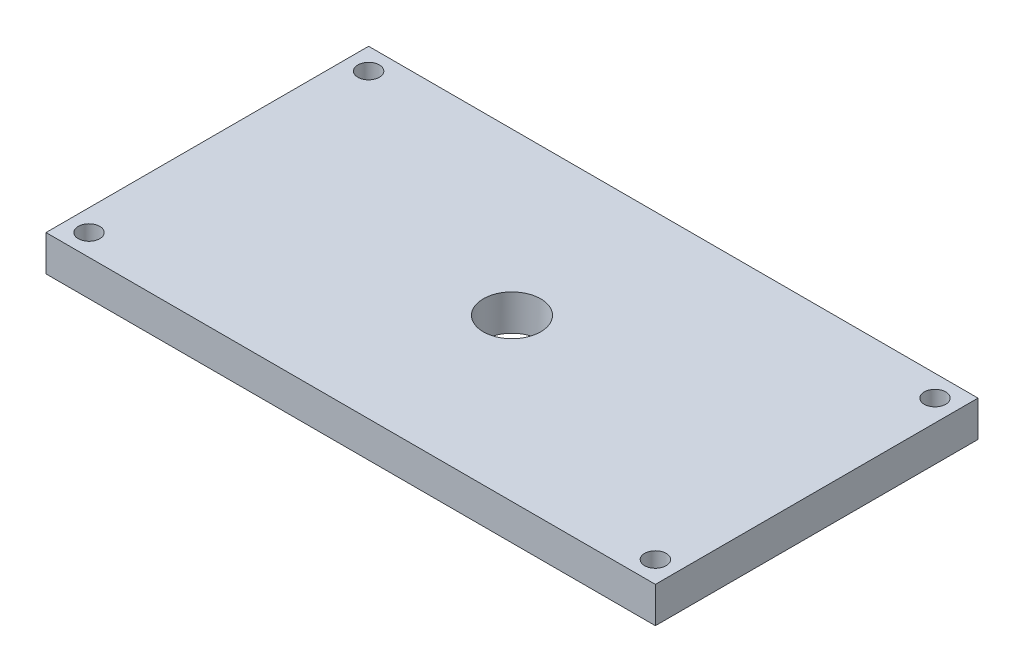
ISO-10303-21;
HEADER;
FILE_DESCRIPTION(('STEP AP214'),'2;1');
FILE_NAME('part.step','',(''),(''),'','','');
FILE_SCHEMA(('AUTOMOTIVE_DESIGN { 1 0 10303 214 1 1 1 1 }'));
ENDSEC;
DATA;
#1=APPLICATION_CONTEXT('core data for automotive mechanical design processes');
#2=APPLICATION_PROTOCOL_DEFINITION('international standard','automotive_design',2000,#1);
#3=PRODUCT_CONTEXT('',#1,'mechanical');
#4=PRODUCT('Part','Part','',(#3));
#5=PRODUCT_RELATED_PRODUCT_CATEGORY('part','',(#4));
#6=PRODUCT_DEFINITION_FORMATION('','',#4);
#7=PRODUCT_DEFINITION_CONTEXT('part definition',#1,'design');
#8=PRODUCT_DEFINITION('design','',#6,#7);
#9=PRODUCT_DEFINITION_SHAPE('','',#8);
#10=(LENGTH_UNIT() NAMED_UNIT(*) SI_UNIT(.MILLI.,.METRE.));
#11=(NAMED_UNIT(*) PLANE_ANGLE_UNIT() SI_UNIT($,.RADIAN.));
#12=(NAMED_UNIT(*) SI_UNIT($,.STERADIAN.) SOLID_ANGLE_UNIT());
#13=UNCERTAINTY_MEASURE_WITH_UNIT(LENGTH_MEASURE(1.E-05),#10,'distance_accuracy_value','');
#14=(GEOMETRIC_REPRESENTATION_CONTEXT(3) GLOBAL_UNCERTAINTY_ASSIGNED_CONTEXT((#13)) GLOBAL_UNIT_ASSIGNED_CONTEXT((#10,
#11,#12)) REPRESENTATION_CONTEXT('',''));
#15=CARTESIAN_POINT('',(0.,0.,0.));
#16=DIRECTION('',(0.,0.,1.));
#17=DIRECTION('',(1.,0.,0.));
#18=AXIS2_PLACEMENT_3D('',#15,#16,#17);
#19=CARTESIAN_POINT('',(0.,5.,0.));
#20=DIRECTION('',(1.,0.,0.));
#21=DIRECTION('',(0.,0.,-1.));
#22=AXIS2_PLACEMENT_3D('',#19,#20,#21);
#23=PLANE('',#22);
#24=DIRECTION('',(0.,0.,1.));
#25=VECTOR('',#24,1.);
#26=CARTESIAN_POINT('',(0.,0.,0.));
#27=LINE('',#26,#25);
#28=CARTESIAN_POINT('',(0.,0.,-45.));
#29=VERTEX_POINT('',#28);
#30=CARTESIAN_POINT('',(0.,0.,0.));
#31=VERTEX_POINT('',#30);
#32=EDGE_CURVE('E103',#29,#31,#27,.T.);
#33=ORIENTED_EDGE('',*,*,#32,.T.);
#34=DIRECTION('',(0.,-1.,0.));
#35=VECTOR('',#34,1.);
#36=CARTESIAN_POINT('',(0.,5.,0.));
#37=LINE('',#36,#35);
#38=CARTESIAN_POINT('',(0.,5.,0.));
#39=VERTEX_POINT('',#38);
#40=EDGE_CURVE('E11',#39,#31,#37,.T.);
#41=ORIENTED_EDGE('',*,*,#40,.F.);
#42=DIRECTION('',(0.,0.,1.));
#43=VECTOR('',#42,1.);
#44=CARTESIAN_POINT('',(0.,5.,0.));
#45=LINE('',#44,#43);
#46=CARTESIAN_POINT('',(0.,5.,-45.));
#47=VERTEX_POINT('',#46);
#48=EDGE_CURVE('E90',#47,#39,#45,.T.);
#49=ORIENTED_EDGE('',*,*,#48,.F.);
#50=DIRECTION('',(0.,-1.,0.));
#51=VECTOR('',#50,1.);
#52=CARTESIAN_POINT('',(0.,5.,-45.));
#53=LINE('',#52,#51);
#54=EDGE_CURVE('E99',#47,#29,#53,.T.);
#55=ORIENTED_EDGE('',*,*,#54,.T.);
#56=EDGE_LOOP('',(#33,#41,#49,#55));
#57=FACE_BOUND('',#56,.T.);
#58=ADVANCED_FACE('F38',(#57),#23,.F.);
#59=CARTESIAN_POINT('',(0.,5.,0.));
#60=DIRECTION('',(0.,0.,-1.));
#61=DIRECTION('',(-1.,0.,0.));
#62=AXIS2_PLACEMENT_3D('',#59,#60,#61);
#63=PLANE('',#62);
#64=DIRECTION('',(1.,0.,0.));
#65=VECTOR('',#64,1.);
#66=CARTESIAN_POINT('',(0.,0.,0.));
#67=LINE('',#66,#65);
#68=CARTESIAN_POINT('',(85.,0.,0.));
#69=VERTEX_POINT('',#68);
#70=EDGE_CURVE('E94',#31,#69,#67,.T.);
#71=ORIENTED_EDGE('',*,*,#70,.T.);
#72=DIRECTION('',(0.,-1.,0.));
#73=VECTOR('',#72,1.);
#74=CARTESIAN_POINT('',(85.,5.,0.));
#75=LINE('',#74,#73);
#76=CARTESIAN_POINT('',(85.,5.,0.));
#77=VERTEX_POINT('',#76);
#78=EDGE_CURVE('E47',#77,#69,#75,.T.);
#79=ORIENTED_EDGE('',*,*,#78,.F.);
#80=DIRECTION('',(1.,0.,0.));
#81=VECTOR('',#80,1.);
#82=CARTESIAN_POINT('',(0.,5.,0.));
#83=LINE('',#82,#81);
#84=EDGE_CURVE('E85',#39,#77,#83,.T.);
#85=ORIENTED_EDGE('',*,*,#84,.F.);
#86=ORIENTED_EDGE('',*,*,#40,.T.);
#87=EDGE_LOOP('',(#71,#79,#85,#86));
#88=FACE_BOUND('',#87,.T.);
#89=ADVANCED_FACE('F93',(#88),#63,.F.);
#90=CARTESIAN_POINT('',(85.,5.,0.));
#91=DIRECTION('',(-1.,0.,0.));
#92=DIRECTION('',(0.,0.,1.));
#93=AXIS2_PLACEMENT_3D('',#90,#91,#92);
#94=PLANE('',#93);
#95=DIRECTION('',(0.,0.,-1.));
#96=VECTOR('',#95,1.);
#97=CARTESIAN_POINT('',(85.,0.,0.));
#98=LINE('',#97,#96);
#99=CARTESIAN_POINT('',(85.,0.,-45.));
#100=VERTEX_POINT('',#99);
#101=EDGE_CURVE('E72',#69,#100,#98,.T.);
#102=ORIENTED_EDGE('',*,*,#101,.T.);
#103=DIRECTION('',(0.,-1.,0.));
#104=VECTOR('',#103,1.);
#105=CARTESIAN_POINT('',(85.,5.,-45.));
#106=LINE('',#105,#104);
#107=CARTESIAN_POINT('',(85.,5.,-45.));
#108=VERTEX_POINT('',#107);
#109=EDGE_CURVE('E95',#108,#100,#106,.T.);
#110=ORIENTED_EDGE('',*,*,#109,.F.);
#111=DIRECTION('',(0.,0.,-1.));
#112=VECTOR('',#111,1.);
#113=CARTESIAN_POINT('',(85.,5.,0.));
#114=LINE('',#113,#112);
#115=EDGE_CURVE('E88',#77,#108,#114,.T.);
#116=ORIENTED_EDGE('',*,*,#115,.F.);
#117=ORIENTED_EDGE('',*,*,#78,.T.);
#118=EDGE_LOOP('',(#102,#110,#116,#117));
#119=FACE_BOUND('',#118,.T.);
#120=ADVANCED_FACE('F97',(#119),#94,.F.);
#121=CARTESIAN_POINT('',(0.,5.,-45.));
#122=DIRECTION('',(0.,0.,1.));
#123=DIRECTION('',(1.,0.,0.));
#124=AXIS2_PLACEMENT_3D('',#121,#122,#123);
#125=PLANE('',#124);
#126=DIRECTION('',(-1.,0.,0.));
#127=VECTOR('',#126,1.);
#128=CARTESIAN_POINT('',(0.,0.,-45.));
#129=LINE('',#128,#127);
#130=EDGE_CURVE('E78',#100,#29,#129,.T.);
#131=ORIENTED_EDGE('',*,*,#130,.T.);
#132=ORIENTED_EDGE('',*,*,#54,.F.);
#133=DIRECTION('',(-1.,0.,0.));
#134=VECTOR('',#133,1.);
#135=CARTESIAN_POINT('',(0.,5.,-45.));
#136=LINE('',#135,#134);
#137=EDGE_CURVE('E55',#108,#47,#136,.T.);
#138=ORIENTED_EDGE('',*,*,#137,.F.);
#139=ORIENTED_EDGE('',*,*,#109,.T.);
#140=EDGE_LOOP('',(#131,#132,#138,#139));
#141=FACE_BOUND('',#140,.T.);
#142=ADVANCED_FACE('F111',(#141),#125,.F.);
#143=CARTESIAN_POINT('',(0.,5.,0.));
#144=DIRECTION('',(0.,-1.,0.));
#145=DIRECTION('',(0.,0.,-1.));
#146=AXIS2_PLACEMENT_3D('',#143,#144,#145);
#147=PLANE('',#146);
#148=CARTESIAN_POINT('',(42.5,5.,-22.5));
#149=DIRECTION('',(0.,1.,0.));
#150=DIRECTION('',(0.,0.,1.));
#151=AXIS2_PLACEMENT_3D('',#148,#149,#150);
#152=CIRCLE('',#151,4.);
#153=CARTESIAN_POINT('',(42.5,5.,-18.5));
#154=VERTEX_POINT('',#153);
#155=EDGE_CURVE('E140',#154,#154,#152,.T.);
#156=ORIENTED_EDGE('',*,*,#155,.F.);
#157=EDGE_LOOP('',(#156));
#158=FACE_BOUND('',#157,.T.);
#159=CARTESIAN_POINT('',(82.,5.,-42.));
#160=DIRECTION('',(0.,1.,0.));
#161=DIRECTION('',(0.,0.,1.));
#162=AXIS2_PLACEMENT_3D('',#159,#160,#161);
#163=CIRCLE('',#162,1.5);
#164=CARTESIAN_POINT('',(82.,5.,-40.5));
#165=VERTEX_POINT('',#164);
#166=EDGE_CURVE('E123',#165,#165,#163,.T.);
#167=ORIENTED_EDGE('',*,*,#166,.F.);
#168=EDGE_LOOP('',(#167));
#169=FACE_BOUND('',#168,.T.);
#170=CARTESIAN_POINT('',(82.,5.,-3.));
#171=DIRECTION('',(0.,1.,0.));
#172=DIRECTION('',(0.,0.,1.));
#173=AXIS2_PLACEMENT_3D('',#170,#171,#172);
#174=CIRCLE('',#173,1.5);
#175=CARTESIAN_POINT('',(82.,5.,-1.5));
#176=VERTEX_POINT('',#175);
#177=EDGE_CURVE('E129',#176,#176,#174,.T.);
#178=ORIENTED_EDGE('',*,*,#177,.F.);
#179=EDGE_LOOP('',(#178));
#180=FACE_BOUND('',#179,.T.);
#181=CARTESIAN_POINT('',(3.,5.,-3.));
#182=DIRECTION('',(0.,1.,0.));
#183=DIRECTION('',(0.,0.,1.));
#184=AXIS2_PLACEMENT_3D('',#181,#182,#183);
#185=CIRCLE('',#184,1.5);
#186=CARTESIAN_POINT('',(3.,5.,-1.5));
#187=VERTEX_POINT('',#186);
#188=EDGE_CURVE('E135',#187,#187,#185,.T.);
#189=ORIENTED_EDGE('',*,*,#188,.F.);
#190=EDGE_LOOP('',(#189));
#191=FACE_BOUND('',#190,.T.);
#192=CARTESIAN_POINT('',(3.,5.,-42.));
#193=DIRECTION('',(0.,1.,0.));
#194=DIRECTION('',(0.,0.,1.));
#195=AXIS2_PLACEMENT_3D('',#192,#193,#194);
#196=CIRCLE('',#195,1.5);
#197=CARTESIAN_POINT('',(3.,5.,-40.5));
#198=VERTEX_POINT('',#197);
#199=EDGE_CURVE('E117',#198,#198,#196,.T.);
#200=ORIENTED_EDGE('',*,*,#199,.F.);
#201=EDGE_LOOP('',(#200));
#202=FACE_BOUND('',#201,.T.);
#203=ORIENTED_EDGE('',*,*,#48,.T.);
#204=ORIENTED_EDGE('',*,*,#84,.T.);
#205=ORIENTED_EDGE('',*,*,#115,.T.);
#206=ORIENTED_EDGE('',*,*,#137,.T.);
#207=EDGE_LOOP('',(#203,#204,#205,#206));
#208=FACE_BOUND('',#207,.T.);
#209=ADVANCED_FACE('F86',(#158,#169,#180,#191,#202,#208),#147,.F.);
#210=CARTESIAN_POINT('',(0.,0.,0.));
#211=DIRECTION('',(0.,-1.,0.));
#212=DIRECTION('',(0.,0.,-1.));
#213=AXIS2_PLACEMENT_3D('',#210,#211,#212);
#214=PLANE('',#213);
#215=CARTESIAN_POINT('',(42.5,0.,-22.5));
#216=DIRECTION('',(0.,-1.,0.));
#217=DIRECTION('',(0.,0.,-1.));
#218=AXIS2_PLACEMENT_3D('',#215,#216,#217);
#219=CIRCLE('',#218,4.);
#220=CARTESIAN_POINT('',(42.5,0.,-26.5));
#221=VERTEX_POINT('',#220);
#222=EDGE_CURVE('E41',#221,#221,#219,.T.);
#223=ORIENTED_EDGE('',*,*,#222,.F.);
#224=EDGE_LOOP('',(#223));
#225=FACE_BOUND('',#224,.T.);
#226=CARTESIAN_POINT('',(82.,0.,-42.));
#227=DIRECTION('',(0.,1.,0.));
#228=DIRECTION('',(0.,0.,1.));
#229=AXIS2_PLACEMENT_3D('',#226,#227,#228);
#230=CIRCLE('',#229,1.5);
#231=CARTESIAN_POINT('',(82.,0.,-40.5));
#232=VERTEX_POINT('',#231);
#233=EDGE_CURVE('E126',#232,#232,#230,.T.);
#234=ORIENTED_EDGE('',*,*,#233,.T.);
#235=EDGE_LOOP('',(#234));
#236=FACE_BOUND('',#235,.T.);
#237=CARTESIAN_POINT('',(82.,0.,-3.));
#238=DIRECTION('',(0.,1.,0.));
#239=DIRECTION('',(0.,0.,1.));
#240=AXIS2_PLACEMENT_3D('',#237,#238,#239);
#241=CIRCLE('',#240,1.5);
#242=CARTESIAN_POINT('',(82.,0.,-1.5));
#243=VERTEX_POINT('',#242);
#244=EDGE_CURVE('E132',#243,#243,#241,.T.);
#245=ORIENTED_EDGE('',*,*,#244,.T.);
#246=EDGE_LOOP('',(#245));
#247=FACE_BOUND('',#246,.T.);
#248=CARTESIAN_POINT('',(3.,0.,-3.));
#249=DIRECTION('',(0.,1.,0.));
#250=DIRECTION('',(0.,0.,1.));
#251=AXIS2_PLACEMENT_3D('',#248,#249,#250);
#252=CIRCLE('',#251,1.5);
#253=CARTESIAN_POINT('',(3.,0.,-1.5));
#254=VERTEX_POINT('',#253);
#255=EDGE_CURVE('E120',#254,#254,#252,.T.);
#256=ORIENTED_EDGE('',*,*,#255,.T.);
#257=EDGE_LOOP('',(#256));
#258=FACE_BOUND('',#257,.T.);
#259=CARTESIAN_POINT('',(3.,0.,-42.));
#260=DIRECTION('',(0.,1.,0.));
#261=DIRECTION('',(0.,0.,1.));
#262=AXIS2_PLACEMENT_3D('',#259,#260,#261);
#263=CIRCLE('',#262,1.5);
#264=CARTESIAN_POINT('',(3.,0.,-40.5));
#265=VERTEX_POINT('',#264);
#266=EDGE_CURVE('E106',#265,#265,#263,.T.);
#267=ORIENTED_EDGE('',*,*,#266,.T.);
#268=EDGE_LOOP('',(#267));
#269=FACE_BOUND('',#268,.T.);
#270=ORIENTED_EDGE('',*,*,#32,.F.);
#271=ORIENTED_EDGE('',*,*,#130,.F.);
#272=ORIENTED_EDGE('',*,*,#101,.F.);
#273=ORIENTED_EDGE('',*,*,#70,.F.);
#274=EDGE_LOOP('',(#270,#271,#272,#273));
#275=FACE_BOUND('',#274,.T.);
#276=ADVANCED_FACE('F114',(#225,#236,#247,#258,#269,#275),#214,.T.);
#277=CARTESIAN_POINT('',(3.,0.,-42.));
#278=DIRECTION('',(0.,1.,0.));
#279=DIRECTION('',(0.,0.,1.));
#280=AXIS2_PLACEMENT_3D('',#277,#278,#279);
#281=CYLINDRICAL_SURFACE('',#280,1.5);
#282=ORIENTED_EDGE('',*,*,#266,.F.);
#283=EDGE_LOOP('',(#282));
#284=FACE_BOUND('',#283,.T.);
#285=ORIENTED_EDGE('',*,*,#199,.T.);
#286=EDGE_LOOP('',(#285));
#287=FACE_BOUND('',#286,.T.);
#288=ADVANCED_FACE('F151',(#284,#287),#281,.F.);
#289=CARTESIAN_POINT('',(3.,0.,-3.));
#290=DIRECTION('',(0.,1.,0.));
#291=DIRECTION('',(0.,0.,1.));
#292=AXIS2_PLACEMENT_3D('',#289,#290,#291);
#293=CYLINDRICAL_SURFACE('',#292,1.5);
#294=ORIENTED_EDGE('',*,*,#255,.F.);
#295=EDGE_LOOP('',(#294));
#296=FACE_BOUND('',#295,.T.);
#297=ORIENTED_EDGE('',*,*,#188,.T.);
#298=EDGE_LOOP('',(#297));
#299=FACE_BOUND('',#298,.T.);
#300=ADVANCED_FACE('F163',(#296,#299),#293,.F.);
#301=CARTESIAN_POINT('',(82.,0.,-3.));
#302=DIRECTION('',(0.,1.,0.));
#303=DIRECTION('',(0.,0.,1.));
#304=AXIS2_PLACEMENT_3D('',#301,#302,#303);
#305=CYLINDRICAL_SURFACE('',#304,1.5);
#306=ORIENTED_EDGE('',*,*,#244,.F.);
#307=EDGE_LOOP('',(#306));
#308=FACE_BOUND('',#307,.T.);
#309=ORIENTED_EDGE('',*,*,#177,.T.);
#310=EDGE_LOOP('',(#309));
#311=FACE_BOUND('',#310,.T.);
#312=ADVANCED_FACE('F206',(#308,#311),#305,.F.);
#313=CARTESIAN_POINT('',(82.,0.,-42.));
#314=DIRECTION('',(0.,1.,0.));
#315=DIRECTION('',(0.,0.,1.));
#316=AXIS2_PLACEMENT_3D('',#313,#314,#315);
#317=CYLINDRICAL_SURFACE('',#316,1.5);
#318=ORIENTED_EDGE('',*,*,#233,.F.);
#319=EDGE_LOOP('',(#318));
#320=FACE_BOUND('',#319,.T.);
#321=ORIENTED_EDGE('',*,*,#166,.T.);
#322=EDGE_LOOP('',(#321));
#323=FACE_BOUND('',#322,.T.);
#324=ADVANCED_FACE('F216',(#320,#323),#317,.F.);
#325=CARTESIAN_POINT('',(42.5,-5.,-22.5));
#326=DIRECTION('',(0.,1.,0.));
#327=DIRECTION('',(0.,0.,1.));
#328=AXIS2_PLACEMENT_3D('',#325,#326,#327);
#329=CYLINDRICAL_SURFACE('',#328,4.);
#330=ORIENTED_EDGE('',*,*,#222,.T.);
#331=EDGE_LOOP('',(#330));
#332=FACE_BOUND('',#331,.T.);
#333=ORIENTED_EDGE('',*,*,#155,.T.);
#334=EDGE_LOOP('',(#333));
#335=FACE_BOUND('',#334,.T.);
#336=ADVANCED_FACE('F147',(#332,#335),#329,.F.);
#337=CLOSED_SHELL('',(#58,#89,#120,#142,#209,#276,#288,#300,#312,#324,#336));
#338=MANIFOLD_SOLID_BREP('B2',#337);
#339=ADVANCED_BREP_SHAPE_REPRESENTATION('',(#18,#338),#14);
#340=SHAPE_DEFINITION_REPRESENTATION(#9,#339);
ENDSEC;
END-ISO-10303-21;
